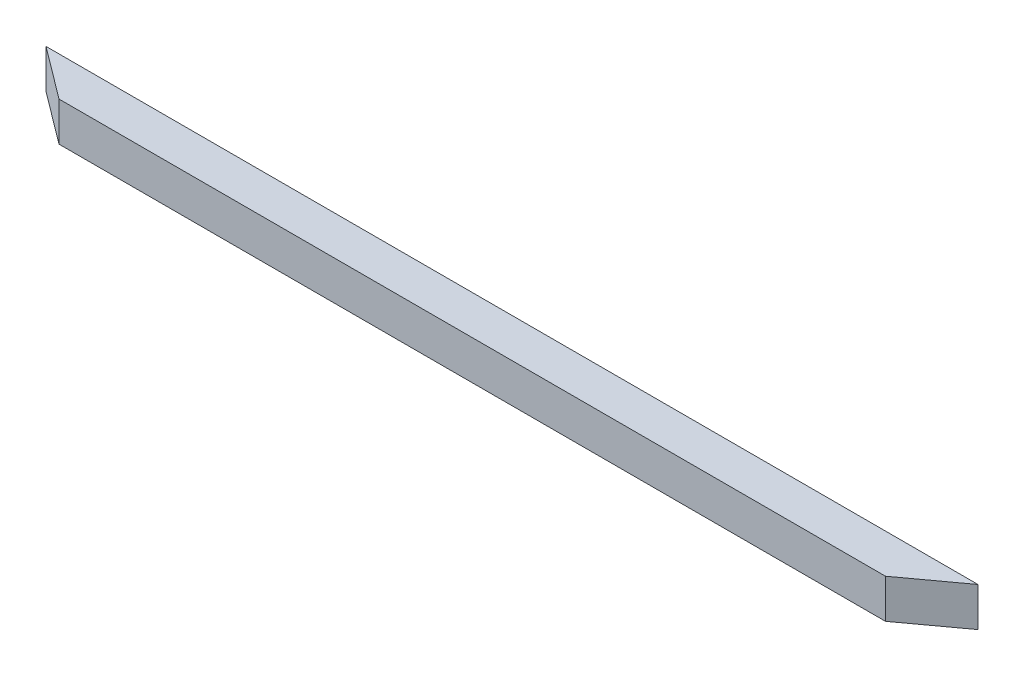
ISO-10303-21;
HEADER;
FILE_DESCRIPTION(('STEP AP214'),'2;1');
FILE_NAME('part.step','',(''),(''),'','','');
FILE_SCHEMA(('AUTOMOTIVE_DESIGN { 1 0 10303 214 1 1 1 1 }'));
ENDSEC;
DATA;
#1=APPLICATION_CONTEXT('core data for automotive mechanical design processes');
#2=APPLICATION_PROTOCOL_DEFINITION('international standard','automotive_design',2000,#1);
#3=PRODUCT_CONTEXT('',#1,'mechanical');
#4=PRODUCT('Part','Part','',(#3));
#5=PRODUCT_RELATED_PRODUCT_CATEGORY('part','',(#4));
#6=PRODUCT_DEFINITION_FORMATION('','',#4);
#7=PRODUCT_DEFINITION_CONTEXT('part definition',#1,'design');
#8=PRODUCT_DEFINITION('design','',#6,#7);
#9=PRODUCT_DEFINITION_SHAPE('','',#8);
#10=(LENGTH_UNIT() NAMED_UNIT(*) SI_UNIT(.MILLI.,.METRE.));
#11=(NAMED_UNIT(*) PLANE_ANGLE_UNIT() SI_UNIT($,.RADIAN.));
#12=(NAMED_UNIT(*) SI_UNIT($,.STERADIAN.) SOLID_ANGLE_UNIT());
#13=UNCERTAINTY_MEASURE_WITH_UNIT(LENGTH_MEASURE(1.E-05),#10,'distance_accuracy_value','');
#14=(GEOMETRIC_REPRESENTATION_CONTEXT(3) GLOBAL_UNCERTAINTY_ASSIGNED_CONTEXT((#13)) GLOBAL_UNIT_ASSIGNED_CONTEXT((#10,
#11,#12)) REPRESENTATION_CONTEXT('',''));
#15=CARTESIAN_POINT('',(0.,0.,0.));
#16=DIRECTION('',(0.,0.,1.));
#17=DIRECTION('',(1.,0.,0.));
#18=AXIS2_PLACEMENT_3D('',#15,#16,#17);
#19=CARTESIAN_POINT('',(-302.768,25.4,-12.7));
#20=DIRECTION('',(0.,0.,1.));
#21=DIRECTION('',(1.,0.,0.));
#22=AXIS2_PLACEMENT_3D('',#19,#20,#21);
#23=PLANE('',#22);
#24=DIRECTION('',(-1.,0.,0.));
#25=VECTOR('',#24,1.);
#26=CARTESIAN_POINT('',(-302.768,0.,-12.7));
#27=LINE('',#26,#25);
#28=CARTESIAN_POINT('',(302.768,0.,-12.7));
#29=VERTEX_POINT('',#28);
#30=CARTESIAN_POINT('',(-302.768,0.,-12.7));
#31=VERTEX_POINT('',#30);
#32=EDGE_CURVE('E96',#29,#31,#27,.T.);
#33=ORIENTED_EDGE('',*,*,#32,.T.);
#34=DIRECTION('',(0.,-1.,0.));
#35=VECTOR('',#34,1.);
#36=CARTESIAN_POINT('',(-302.768,25.4,-12.7));
#37=LINE('',#36,#35);
#38=CARTESIAN_POINT('',(-302.768,25.4,-12.7));
#39=VERTEX_POINT('',#38);
#40=EDGE_CURVE('E11',#39,#31,#37,.T.);
#41=ORIENTED_EDGE('',*,*,#40,.F.);
#42=DIRECTION('',(-1.,0.,0.));
#43=VECTOR('',#42,1.);
#44=CARTESIAN_POINT('',(-302.768,25.4,-12.7));
#45=LINE('',#44,#43);
#46=CARTESIAN_POINT('',(302.768,25.4,-12.7));
#47=VERTEX_POINT('',#46);
#48=EDGE_CURVE('E84',#47,#39,#45,.T.);
#49=ORIENTED_EDGE('',*,*,#48,.F.);
#50=DIRECTION('',(0.,-1.,0.));
#51=VECTOR('',#50,1.);
#52=CARTESIAN_POINT('',(302.768,25.4,-12.7));
#53=LINE('',#52,#51);
#54=EDGE_CURVE('E92',#47,#29,#53,.T.);
#55=ORIENTED_EDGE('',*,*,#54,.T.);
#56=EDGE_LOOP('',(#33,#41,#49,#55));
#57=FACE_BOUND('',#56,.T.);
#58=ADVANCED_FACE('F33',(#57),#23,.F.);
#59=CARTESIAN_POINT('',(-302.768,25.4,-12.7));
#60=DIRECTION('',(0.600030853215301,0.,-0.799976859158887));
#61=DIRECTION('',(-0.799976859158887,0.,-0.600030853215301));
#62=AXIS2_PLACEMENT_3D('',#59,#60,#61);
#63=PLANE('',#62);
#64=DIRECTION('',(0.799976859158887,0.,0.600030853215301));
#65=VECTOR('',#64,1.);
#66=CARTESIAN_POINT('',(-302.768,0.,-12.7));
#67=LINE('',#66,#65);
#68=CARTESIAN_POINT('',(-268.904054314953,0.,12.7));
#69=VERTEX_POINT('',#68);
#70=EDGE_CURVE('E88',#31,#69,#67,.T.);
#71=ORIENTED_EDGE('',*,*,#70,.T.);
#72=DIRECTION('',(0.,-1.,0.));
#73=VECTOR('',#72,1.);
#74=CARTESIAN_POINT('',(-268.904054314953,25.4,12.7));
#75=LINE('',#74,#73);
#76=CARTESIAN_POINT('',(-268.904054314953,25.4,12.7));
#77=VERTEX_POINT('',#76);
#78=EDGE_CURVE('E41',#77,#69,#75,.T.);
#79=ORIENTED_EDGE('',*,*,#78,.F.);
#80=DIRECTION('',(0.799976859158887,0.,0.600030853215301));
#81=VECTOR('',#80,1.);
#82=CARTESIAN_POINT('',(-302.768,25.4,-12.7));
#83=LINE('',#82,#81);
#84=EDGE_CURVE('E79',#39,#77,#83,.T.);
#85=ORIENTED_EDGE('',*,*,#84,.F.);
#86=ORIENTED_EDGE('',*,*,#40,.T.);
#87=EDGE_LOOP('',(#71,#79,#85,#86));
#88=FACE_BOUND('',#87,.T.);
#89=ADVANCED_FACE('F87',(#88),#63,.F.);
#90=CARTESIAN_POINT('',(-268.904054314953,25.4,12.7));
#91=DIRECTION('',(0.,0.,-1.));
#92=DIRECTION('',(-1.,0.,0.));
#93=AXIS2_PLACEMENT_3D('',#90,#91,#92);
#94=PLANE('',#93);
#95=DIRECTION('',(1.,0.,0.));
#96=VECTOR('',#95,1.);
#97=CARTESIAN_POINT('',(-268.904054314953,0.,12.7));
#98=LINE('',#97,#96);
#99=CARTESIAN_POINT('',(268.046906024043,0.,12.7));
#100=VERTEX_POINT('',#99);
#101=EDGE_CURVE('E66',#69,#100,#98,.T.);
#102=ORIENTED_EDGE('',*,*,#101,.T.);
#103=DIRECTION('',(0.,-1.,0.));
#104=VECTOR('',#103,1.);
#105=CARTESIAN_POINT('',(268.046906024043,25.4,12.7));
#106=LINE('',#105,#104);
#107=CARTESIAN_POINT('',(268.046906024043,25.4,12.7));
#108=VERTEX_POINT('',#107);
#109=EDGE_CURVE('E89',#108,#100,#106,.T.);
#110=ORIENTED_EDGE('',*,*,#109,.F.);
#111=DIRECTION('',(1.,0.,0.));
#112=VECTOR('',#111,1.);
#113=CARTESIAN_POINT('',(-268.904054314953,25.4,12.7));
#114=LINE('',#113,#112);
#115=EDGE_CURVE('E82',#77,#108,#114,.T.);
#116=ORIENTED_EDGE('',*,*,#115,.F.);
#117=ORIENTED_EDGE('',*,*,#78,.T.);
#118=EDGE_LOOP('',(#102,#110,#116,#117));
#119=FACE_BOUND('',#118,.T.);
#120=ADVANCED_FACE('F90',(#119),#94,.F.);
#121=CARTESIAN_POINT('',(302.768,25.4,-12.7));
#122=DIRECTION('',(-0.590424021396648,0.,-0.807093225691934));
#123=DIRECTION('',(-0.807093225691934,0.,0.590424021396648));
#124=AXIS2_PLACEMENT_3D('',#121,#122,#123);
#125=PLANE('',#124);
#126=DIRECTION('',(0.807093225691934,0.,-0.590424021396648));
#127=VECTOR('',#126,1.);
#128=CARTESIAN_POINT('',(302.768,0.,-12.7));
#129=LINE('',#128,#127);
#130=EDGE_CURVE('E72',#100,#29,#129,.T.);
#131=ORIENTED_EDGE('',*,*,#130,.T.);
#132=ORIENTED_EDGE('',*,*,#54,.F.);
#133=DIRECTION('',(0.807093225691934,0.,-0.590424021396648));
#134=VECTOR('',#133,1.);
#135=CARTESIAN_POINT('',(302.768,25.4,-12.7));
#136=LINE('',#135,#134);
#137=EDGE_CURVE('E49',#108,#47,#136,.T.);
#138=ORIENTED_EDGE('',*,*,#137,.F.);
#139=ORIENTED_EDGE('',*,*,#109,.T.);
#140=EDGE_LOOP('',(#131,#132,#138,#139));
#141=FACE_BOUND('',#140,.T.);
#142=ADVANCED_FACE('F103',(#141),#125,.F.);
#143=CARTESIAN_POINT('',(0.,25.4,0.));
#144=DIRECTION('',(0.,-1.,0.));
#145=DIRECTION('',(0.,0.,-1.));
#146=AXIS2_PLACEMENT_3D('',#143,#144,#145);
#147=PLANE('',#146);
#148=ORIENTED_EDGE('',*,*,#48,.T.);
#149=ORIENTED_EDGE('',*,*,#84,.T.);
#150=ORIENTED_EDGE('',*,*,#115,.T.);
#151=ORIENTED_EDGE('',*,*,#137,.T.);
#152=EDGE_LOOP('',(#148,#149,#150,#151));
#153=FACE_BOUND('',#152,.T.);
#154=ADVANCED_FACE('F80',(#153),#147,.F.);
#155=CARTESIAN_POINT('',(0.,0.,0.));
#156=DIRECTION('',(0.,-1.,0.));
#157=DIRECTION('',(0.,0.,-1.));
#158=AXIS2_PLACEMENT_3D('',#155,#156,#157);
#159=PLANE('',#158);
#160=ORIENTED_EDGE('',*,*,#32,.F.);
#161=ORIENTED_EDGE('',*,*,#130,.F.);
#162=ORIENTED_EDGE('',*,*,#101,.F.);
#163=ORIENTED_EDGE('',*,*,#70,.F.);
#164=EDGE_LOOP('',(#160,#161,#162,#163));
#165=FACE_BOUND('',#164,.T.);
#166=ADVANCED_FACE('F106',(#165),#159,.T.);
#167=CLOSED_SHELL('',(#58,#89,#120,#142,#154,#166));
#168=MANIFOLD_SOLID_BREP('B2',#167);
#169=ADVANCED_BREP_SHAPE_REPRESENTATION('',(#18,#168),#14);
#170=SHAPE_DEFINITION_REPRESENTATION(#9,#169);
ENDSEC;
END-ISO-10303-21;
